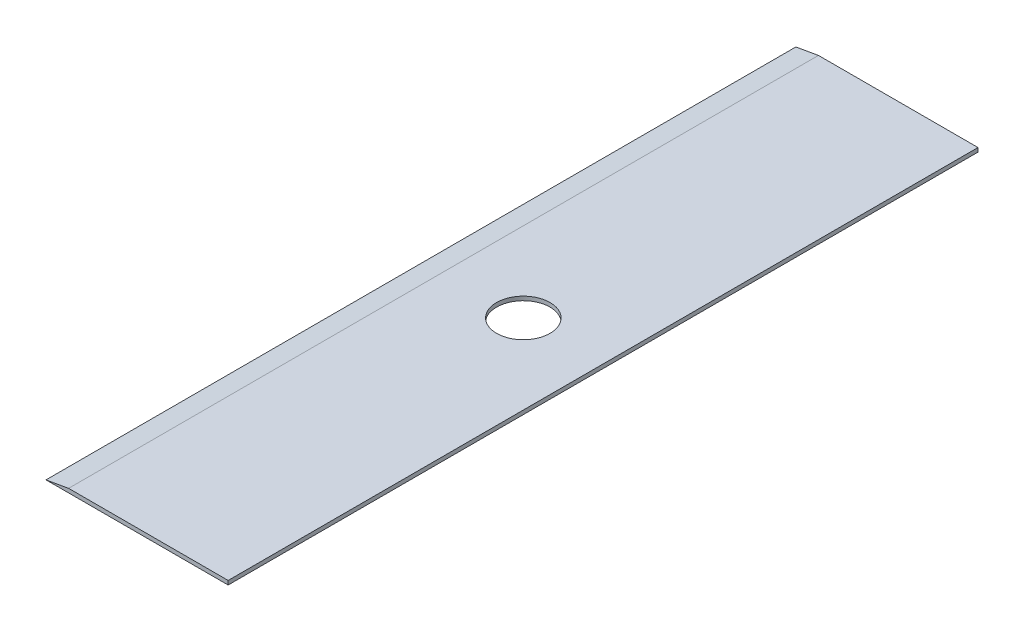
ISO-10303-21;
HEADER;
FILE_DESCRIPTION(('STEP AP214'),'2;1');
FILE_NAME('part.step','',(''),(''),'','','');
FILE_SCHEMA(('AUTOMOTIVE_DESIGN { 1 0 10303 214 1 1 1 1 }'));
ENDSEC;
DATA;
#1=APPLICATION_CONTEXT('core data for automotive mechanical design processes');
#2=APPLICATION_PROTOCOL_DEFINITION('international standard','automotive_design',2000,#1);
#3=PRODUCT_CONTEXT('',#1,'mechanical');
#4=PRODUCT('Part','Part','',(#3));
#5=PRODUCT_RELATED_PRODUCT_CATEGORY('part','',(#4));
#6=PRODUCT_DEFINITION_FORMATION('','',#4);
#7=PRODUCT_DEFINITION_CONTEXT('part definition',#1,'design');
#8=PRODUCT_DEFINITION('design','',#6,#7);
#9=PRODUCT_DEFINITION_SHAPE('','',#8);
#10=(LENGTH_UNIT() NAMED_UNIT(*) SI_UNIT(.MILLI.,.METRE.));
#11=(NAMED_UNIT(*) PLANE_ANGLE_UNIT() SI_UNIT($,.RADIAN.));
#12=(NAMED_UNIT(*) SI_UNIT($,.STERADIAN.) SOLID_ANGLE_UNIT());
#13=UNCERTAINTY_MEASURE_WITH_UNIT(LENGTH_MEASURE(1.E-05),#10,'distance_accuracy_value','');
#14=(GEOMETRIC_REPRESENTATION_CONTEXT(3) GLOBAL_UNCERTAINTY_ASSIGNED_CONTEXT((#13)) GLOBAL_UNIT_ASSIGNED_CONTEXT((#10,
#11,#12)) REPRESENTATION_CONTEXT('',''));
#15=CARTESIAN_POINT('',(0.,0.,0.));
#16=DIRECTION('',(0.,0.,1.));
#17=DIRECTION('',(1.,0.,0.));
#18=AXIS2_PLACEMENT_3D('',#15,#16,#17);
#19=CARTESIAN_POINT('',(0.,0.,11.938));
#20=DIRECTION('',(0.,1.,0.));
#21=DIRECTION('',(0.,0.,1.));
#22=AXIS2_PLACEMENT_3D('',#19,#20,#21);
#23=PLANE('',#22);
#24=CARTESIAN_POINT('',(2.54,0.,0.));
#25=DIRECTION('',(0.,1.,0.));
#26=DIRECTION('',(0.,0.,1.));
#27=AXIS2_PLACEMENT_3D('',#24,#25,#26);
#28=CIRCLE('',#27,0.8509);
#29=CARTESIAN_POINT('',(2.54,0.,0.8509));
#30=VERTEX_POINT('',#29);
#31=EDGE_CURVE('E101',#30,#30,#28,.F.);
#32=ORIENTED_EDGE('',*,*,#31,.F.);
#33=EDGE_LOOP('',(#32));
#34=FACE_BOUND('',#33,.T.);
#35=DIRECTION('',(1.,0.,0.));
#36=VECTOR('',#35,1.);
#37=CARTESIAN_POINT('',(0.,0.,-11.938));
#38=LINE('',#37,#36);
#39=CARTESIAN_POINT('',(-0.720252791091473,0.,-11.938));
#40=VERTEX_POINT('',#39);
#41=CARTESIAN_POINT('',(5.08,0.,-11.938));
#42=VERTEX_POINT('',#41);
#43=EDGE_CURVE('E76',#40,#42,#38,.T.);
#44=ORIENTED_EDGE('',*,*,#43,.T.);
#45=DIRECTION('',(0.,0.,-1.));
#46=VECTOR('',#45,1.);
#47=CARTESIAN_POINT('',(5.08,0.,11.938));
#48=LINE('',#47,#46);
#49=CARTESIAN_POINT('',(5.08,0.,11.938));
#50=VERTEX_POINT('',#49);
#51=EDGE_CURVE('E11',#50,#42,#48,.T.);
#52=ORIENTED_EDGE('',*,*,#51,.F.);
#53=DIRECTION('',(1.,0.,0.));
#54=VECTOR('',#53,1.);
#55=CARTESIAN_POINT('',(0.,0.,11.938));
#56=LINE('',#55,#54);
#57=CARTESIAN_POINT('',(-0.720252791091473,0.,11.9379999999999));
#58=VERTEX_POINT('',#57);
#59=EDGE_CURVE('E81',#58,#50,#56,.T.);
#60=ORIENTED_EDGE('',*,*,#59,.F.);
#61=DIRECTION('',(0.,0.,-1.));
#62=VECTOR('',#61,1.);
#63=CARTESIAN_POINT('',(-0.720252791091473,0.,11.9379999999999));
#64=LINE('',#63,#62);
#65=EDGE_CURVE('E96',#58,#40,#64,.T.);
#66=ORIENTED_EDGE('',*,*,#65,.T.);
#67=EDGE_LOOP('',(#44,#52,#60,#66));
#68=FACE_BOUND('',#67,.T.);
#69=ADVANCED_FACE('F36',(#34,#68),#23,.F.);
#70=CARTESIAN_POINT('',(5.08,0.,11.938));
#71=DIRECTION('',(-1.,0.,0.));
#72=DIRECTION('',(0.,0.,1.));
#73=AXIS2_PLACEMENT_3D('',#70,#71,#72);
#74=PLANE('',#73);
#75=DIRECTION('',(0.,1.,0.));
#76=VECTOR('',#75,1.);
#77=CARTESIAN_POINT('',(5.08,0.,-11.938));
#78=LINE('',#77,#76);
#79=CARTESIAN_POINT('',(5.08,0.126999999999999,-11.938));
#80=VERTEX_POINT('',#79);
#81=EDGE_CURVE('E92',#42,#80,#78,.T.);
#82=ORIENTED_EDGE('',*,*,#81,.T.);
#83=DIRECTION('',(0.,0.,-1.));
#84=VECTOR('',#83,1.);
#85=CARTESIAN_POINT('',(5.08,0.126999999999997,11.938));
#86=LINE('',#85,#84);
#87=CARTESIAN_POINT('',(5.08,0.126999999999997,11.938));
#88=VERTEX_POINT('',#87);
#89=EDGE_CURVE('E44',#88,#80,#86,.T.);
#90=ORIENTED_EDGE('',*,*,#89,.F.);
#91=DIRECTION('',(0.,1.,0.));
#92=VECTOR('',#91,1.);
#93=CARTESIAN_POINT('',(5.08,0.,11.938));
#94=LINE('',#93,#92);
#95=EDGE_CURVE('E84',#50,#88,#94,.T.);
#96=ORIENTED_EDGE('',*,*,#95,.F.);
#97=ORIENTED_EDGE('',*,*,#51,.T.);
#98=EDGE_LOOP('',(#82,#90,#96,#97));
#99=FACE_BOUND('',#98,.T.);
#100=ADVANCED_FACE('F91',(#99),#74,.F.);
#101=CARTESIAN_POINT('',(5.08,0.126999999999997,11.938));
#102=DIRECTION('',(0.,-1.,0.));
#103=DIRECTION('',(1.,0.,0.));
#104=AXIS2_PLACEMENT_3D('',#101,#102,#103);
#105=PLANE('',#104);
#106=CARTESIAN_POINT('',(2.54,0.126999999999999,0.));
#107=DIRECTION('',(0.,1.,0.));
#108=DIRECTION('',(-1.,0.,0.));
#109=AXIS2_PLACEMENT_3D('',#106,#107,#108);
#110=CIRCLE('',#109,0.8509);
#111=CARTESIAN_POINT('',(1.6891,0.126999999999999,0.));
#112=VERTEX_POINT('',#111);
#113=EDGE_CURVE('E132',#112,#112,#110,.T.);
#114=ORIENTED_EDGE('',*,*,#113,.F.);
#115=EDGE_LOOP('',(#114));
#116=FACE_BOUND('',#115,.T.);
#117=DIRECTION('',(-1.,0.,0.));
#118=VECTOR('',#117,1.);
#119=CARTESIAN_POINT('',(5.08,0.126999999999999,-11.938));
#120=LINE('',#119,#118);
#121=CARTESIAN_POINT('',(0.,0.127,-11.938));
#122=VERTEX_POINT('',#121);
#123=EDGE_CURVE('E69',#80,#122,#120,.T.);
#124=ORIENTED_EDGE('',*,*,#123,.T.);
#125=DIRECTION('',(0.,0.,-1.));
#126=VECTOR('',#125,1.);
#127=CARTESIAN_POINT('',(0.,0.126999999999997,11.9379999999999));
#128=LINE('',#127,#126);
#129=CARTESIAN_POINT('',(0.,0.126999999999997,11.9379999999999));
#130=VERTEX_POINT('',#129);
#131=EDGE_CURVE('E93',#130,#122,#128,.T.);
#132=ORIENTED_EDGE('',*,*,#131,.F.);
#133=DIRECTION('',(-1.,0.,0.));
#134=VECTOR('',#133,1.);
#135=CARTESIAN_POINT('',(5.08,0.126999999999997,11.938));
#136=LINE('',#135,#134);
#137=EDGE_CURVE('E88',#88,#130,#136,.T.);
#138=ORIENTED_EDGE('',*,*,#137,.F.);
#139=ORIENTED_EDGE('',*,*,#89,.T.);
#140=EDGE_LOOP('',(#124,#132,#138,#139));
#141=FACE_BOUND('',#140,.T.);
#142=ADVANCED_FACE('F94',(#116,#141),#105,.F.);
#143=CARTESIAN_POINT('',(-0.720252791091473,0.,11.9379999999999));
#144=DIRECTION('',(0.173648177666925,-0.984807753012209,0.));
#145=DIRECTION('',(0.984807753012209,0.173648177666925,0.));
#146=AXIS2_PLACEMENT_3D('',#143,#144,#145);
#147=PLANE('',#146);
#148=DIRECTION('',(-0.984807753012209,-0.173648177666925,0.));
#149=VECTOR('',#148,1.);
#150=CARTESIAN_POINT('',(-0.720252791091473,0.,-11.938));
#151=LINE('',#150,#149);
#152=EDGE_CURVE('E104',#122,#40,#151,.T.);
#153=ORIENTED_EDGE('',*,*,#152,.T.);
#154=ORIENTED_EDGE('',*,*,#65,.F.);
#155=DIRECTION('',(-0.984807753012209,-0.173648177666925,0.));
#156=VECTOR('',#155,1.);
#157=CARTESIAN_POINT('',(-0.720252791091473,0.,11.9379999999999));
#158=LINE('',#157,#156);
#159=EDGE_CURVE('E52',#130,#58,#158,.T.);
#160=ORIENTED_EDGE('',*,*,#159,.F.);
#161=ORIENTED_EDGE('',*,*,#131,.T.);
#162=EDGE_LOOP('',(#153,#154,#160,#161));
#163=FACE_BOUND('',#162,.T.);
#164=ADVANCED_FACE('F109',(#163),#147,.F.);
#165=CARTESIAN_POINT('',(0.,0.,11.938));
#166=DIRECTION('',(0.,0.,-1.));
#167=DIRECTION('',(-1.,0.,0.));
#168=AXIS2_PLACEMENT_3D('',#165,#166,#167);
#169=PLANE('',#168);
#170=ORIENTED_EDGE('',*,*,#59,.T.);
#171=ORIENTED_EDGE('',*,*,#95,.T.);
#172=ORIENTED_EDGE('',*,*,#137,.T.);
#173=ORIENTED_EDGE('',*,*,#159,.T.);
#174=EDGE_LOOP('',(#170,#171,#172,#173));
#175=FACE_BOUND('',#174,.T.);
#176=ADVANCED_FACE('F86',(#175),#169,.F.);
#177=CARTESIAN_POINT('',(0.,0.,-11.938));
#178=DIRECTION('',(0.,0.,-1.));
#179=DIRECTION('',(-1.,0.,0.));
#180=AXIS2_PLACEMENT_3D('',#177,#178,#179);
#181=PLANE('',#180);
#182=ORIENTED_EDGE('',*,*,#43,.F.);
#183=ORIENTED_EDGE('',*,*,#152,.F.);
#184=ORIENTED_EDGE('',*,*,#123,.F.);
#185=ORIENTED_EDGE('',*,*,#81,.F.);
#186=EDGE_LOOP('',(#182,#183,#184,#185));
#187=FACE_BOUND('',#186,.T.);
#188=ADVANCED_FACE('F110',(#187),#181,.T.);
#189=CARTESIAN_POINT('',(2.54,-2.40670864044653,0.));
#190=DIRECTION('',(0.,1.,0.));
#191=DIRECTION('',(-1.,0.,0.));
#192=AXIS2_PLACEMENT_3D('',#189,#190,#191);
#193=CYLINDRICAL_SURFACE('',#192,0.8509);
#194=ORIENTED_EDGE('',*,*,#31,.T.);
#195=EDGE_LOOP('',(#194));
#196=FACE_BOUND('',#195,.T.);
#197=ORIENTED_EDGE('',*,*,#113,.T.);
#198=EDGE_LOOP('',(#197));
#199=FACE_BOUND('',#198,.T.);
#200=ADVANCED_FACE('F112',(#196,#199),#193,.F.);
#201=CLOSED_SHELL('',(#69,#100,#142,#164,#176,#188,#200));
#202=MANIFOLD_SOLID_BREP('B2',#201);
#203=ADVANCED_BREP_SHAPE_REPRESENTATION('',(#18,#202),#14);
#204=SHAPE_DEFINITION_REPRESENTATION(#9,#203);
ENDSEC;
END-ISO-10303-21;
